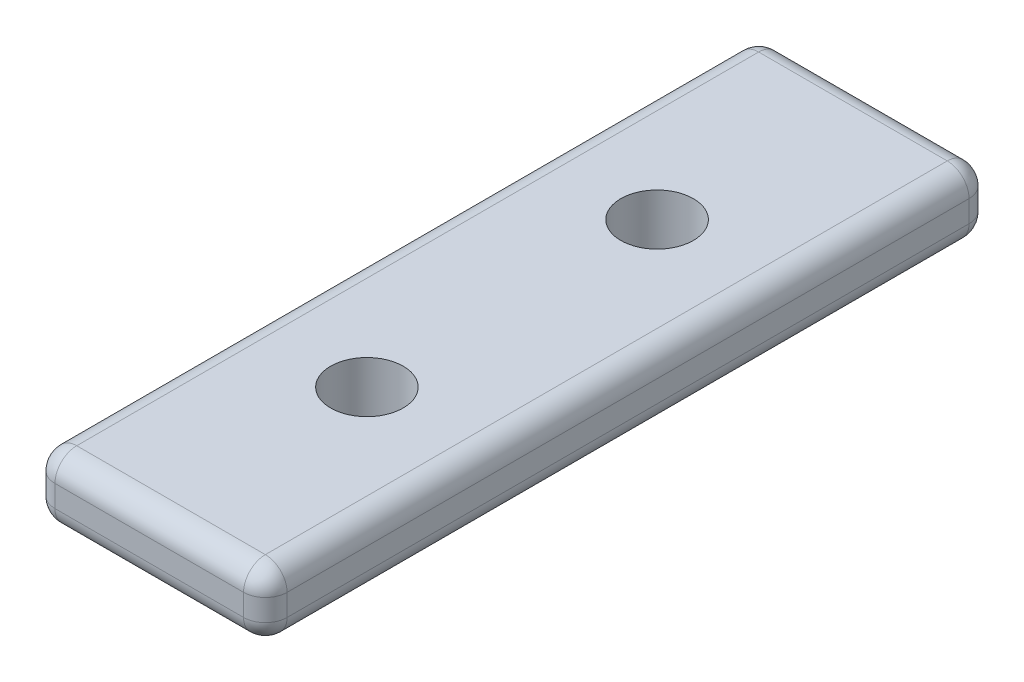
ISO-10303-21;
HEADER;
FILE_DESCRIPTION(('STEP AP214'),'2;1');
FILE_NAME('part.step','',(''),(''),'','','');
FILE_SCHEMA(('AUTOMOTIVE_DESIGN { 1 0 10303 214 1 1 1 1 }'));
ENDSEC;
DATA;
#1=APPLICATION_CONTEXT('core data for automotive mechanical design processes');
#2=APPLICATION_PROTOCOL_DEFINITION('international standard','automotive_design',2000,#1);
#3=PRODUCT_CONTEXT('',#1,'mechanical');
#4=PRODUCT('Part','Part','',(#3));
#5=PRODUCT_RELATED_PRODUCT_CATEGORY('part','',(#4));
#6=PRODUCT_DEFINITION_FORMATION('','',#4);
#7=PRODUCT_DEFINITION_CONTEXT('part definition',#1,'design');
#8=PRODUCT_DEFINITION('design','',#6,#7);
#9=PRODUCT_DEFINITION_SHAPE('','',#8);
#10=(LENGTH_UNIT() NAMED_UNIT(*) SI_UNIT(.MILLI.,.METRE.));
#11=(NAMED_UNIT(*) PLANE_ANGLE_UNIT() SI_UNIT($,.RADIAN.));
#12=(NAMED_UNIT(*) SI_UNIT($,.STERADIAN.) SOLID_ANGLE_UNIT());
#13=UNCERTAINTY_MEASURE_WITH_UNIT(LENGTH_MEASURE(1.E-05),#10,'distance_accuracy_value','');
#14=(GEOMETRIC_REPRESENTATION_CONTEXT(3) GLOBAL_UNCERTAINTY_ASSIGNED_CONTEXT((#13)) GLOBAL_UNIT_ASSIGNED_CONTEXT((#10,
#11,#12)) REPRESENTATION_CONTEXT('',''));
#15=CARTESIAN_POINT('',(0.,0.,0.));
#16=DIRECTION('',(0.,0.,1.));
#17=DIRECTION('',(1.,0.,0.));
#18=AXIS2_PLACEMENT_3D('',#15,#16,#17);
#19=CARTESIAN_POINT('',(8.,2.25,50.));
#20=DIRECTION('',(-1.,0.,0.));
#21=DIRECTION('',(0.,0.,1.));
#22=AXIS2_PLACEMENT_3D('',#19,#20,#21);
#23=PLANE('',#22);
#24=DIRECTION('',(0.,0.,-1.));
#25=VECTOR('',#24,1.);
#26=CARTESIAN_POINT('',(8.,0.75,50.));
#27=LINE('',#26,#25);
#28=CARTESIAN_POINT('',(8.,0.75,1.5));
#29=VERTEX_POINT('',#28);
#30=CARTESIAN_POINT('',(8.,0.75,48.5));
#31=VERTEX_POINT('',#30);
#32=EDGE_CURVE('E166',#29,#31,#27,.F.);
#33=ORIENTED_EDGE('',*,*,#32,.T.);
#34=DIRECTION('',(0.,1.,0.));
#35=VECTOR('',#34,1.);
#36=CARTESIAN_POINT('',(8.,-2.25,48.5));
#37=LINE('',#36,#35);
#38=CARTESIAN_POINT('',(8.,-0.75,48.5));
#39=VERTEX_POINT('',#38);
#40=EDGE_CURVE('E172',#31,#39,#37,.F.);
#41=ORIENTED_EDGE('',*,*,#40,.T.);
#42=DIRECTION('',(0.,0.,-1.));
#43=VECTOR('',#42,1.);
#44=CARTESIAN_POINT('',(8.,-0.75,50.));
#45=LINE('',#44,#43);
#46=CARTESIAN_POINT('',(8.,-0.75,1.5));
#47=VERTEX_POINT('',#46);
#48=EDGE_CURVE('E170',#39,#47,#45,.T.);
#49=ORIENTED_EDGE('',*,*,#48,.T.);
#50=DIRECTION('',(0.,1.,0.));
#51=VECTOR('',#50,1.);
#52=CARTESIAN_POINT('',(8.,2.25,1.5));
#53=LINE('',#52,#51);
#54=EDGE_CURVE('E168',#47,#29,#53,.T.);
#55=ORIENTED_EDGE('',*,*,#54,.T.);
#56=EDGE_LOOP('',(#33,#41,#49,#55));
#57=FACE_BOUND('',#56,.T.);
#58=ADVANCED_FACE('F30',(#57),#23,.F.);
#59=CARTESIAN_POINT('',(-8.,2.25,50.));
#60=DIRECTION('',(0.,-1.,0.));
#61=DIRECTION('',(0.,0.,-1.));
#62=AXIS2_PLACEMENT_3D('',#59,#60,#61);
#63=PLANE('',#62);
#64=CARTESIAN_POINT('',(0.,2.25,35.));
#65=DIRECTION('',(0.,-1.,0.));
#66=DIRECTION('',(0.,0.,-1.));
#67=AXIS2_PLACEMENT_3D('',#64,#65,#66);
#68=CIRCLE('',#67,2.5);
#69=CARTESIAN_POINT('',(0.,2.25,32.5));
#70=VERTEX_POINT('',#69);
#71=EDGE_CURVE('E557',#70,#70,#68,.T.);
#72=ORIENTED_EDGE('',*,*,#71,.T.);
#73=EDGE_LOOP('',(#72));
#74=FACE_BOUND('',#73,.T.);
#75=CARTESIAN_POINT('',(0.,2.25,15.));
#76=DIRECTION('',(0.,-1.,0.));
#77=DIRECTION('',(0.,0.,-1.));
#78=AXIS2_PLACEMENT_3D('',#75,#76,#77);
#79=CIRCLE('',#78,2.5);
#80=CARTESIAN_POINT('',(0.,2.25,12.5));
#81=VERTEX_POINT('',#80);
#82=EDGE_CURVE('E129',#81,#81,#79,.T.);
#83=ORIENTED_EDGE('',*,*,#82,.T.);
#84=EDGE_LOOP('',(#83));
#85=FACE_BOUND('',#84,.T.);
#86=DIRECTION('',(-1.,0.,0.));
#87=VECTOR('',#86,1.);
#88=CARTESIAN_POINT('',(-8.,2.25,1.5));
#89=LINE('',#88,#87);
#90=CARTESIAN_POINT('',(6.5,2.25,1.5));
#91=VERTEX_POINT('',#90);
#92=CARTESIAN_POINT('',(-6.5,2.25,1.5));
#93=VERTEX_POINT('',#92);
#94=EDGE_CURVE('E177',#91,#93,#89,.T.);
#95=ORIENTED_EDGE('',*,*,#94,.T.);
#96=DIRECTION('',(0.,0.,-1.));
#97=VECTOR('',#96,1.);
#98=CARTESIAN_POINT('',(-6.5,2.25,50.));
#99=LINE('',#98,#97);
#100=CARTESIAN_POINT('',(-6.5,2.25,48.5));
#101=VERTEX_POINT('',#100);
#102=EDGE_CURVE('E182',#93,#101,#99,.F.);
#103=ORIENTED_EDGE('',*,*,#102,.T.);
#104=DIRECTION('',(-1.,0.,0.));
#105=VECTOR('',#104,1.);
#106=CARTESIAN_POINT('',(8.,2.25,48.5));
#107=LINE('',#106,#105);
#108=CARTESIAN_POINT('',(6.5,2.25,48.5));
#109=VERTEX_POINT('',#108);
#110=EDGE_CURVE('E179',#101,#109,#107,.F.);
#111=ORIENTED_EDGE('',*,*,#110,.T.);
#112=DIRECTION('',(0.,0.,-1.));
#113=VECTOR('',#112,1.);
#114=CARTESIAN_POINT('',(6.5,2.25,50.));
#115=LINE('',#114,#113);
#116=EDGE_CURVE('E175',#109,#91,#115,.T.);
#117=ORIENTED_EDGE('',*,*,#116,.T.);
#118=EDGE_LOOP('',(#95,#103,#111,#117));
#119=FACE_BOUND('',#118,.T.);
#120=ADVANCED_FACE('F267',(#74,#85,#119),#63,.F.);
#121=CARTESIAN_POINT('',(-8.,2.25,50.));
#122=DIRECTION('',(1.,0.,0.));
#123=DIRECTION('',(0.,0.,-1.));
#124=AXIS2_PLACEMENT_3D('',#121,#122,#123);
#125=PLANE('',#124);
#126=DIRECTION('',(0.,0.,-1.));
#127=VECTOR('',#126,1.);
#128=CARTESIAN_POINT('',(-8.,-0.75,50.));
#129=LINE('',#128,#127);
#130=CARTESIAN_POINT('',(-8.,-0.75,1.5));
#131=VERTEX_POINT('',#130);
#132=CARTESIAN_POINT('',(-8.,-0.75,48.5));
#133=VERTEX_POINT('',#132);
#134=EDGE_CURVE('E163',#131,#133,#129,.F.);
#135=ORIENTED_EDGE('',*,*,#134,.T.);
#136=DIRECTION('',(0.,-1.,0.));
#137=VECTOR('',#136,1.);
#138=CARTESIAN_POINT('',(-8.,2.25,48.5));
#139=LINE('',#138,#137);
#140=CARTESIAN_POINT('',(-8.,0.75,48.5));
#141=VERTEX_POINT('',#140);
#142=EDGE_CURVE('E126',#133,#141,#139,.F.);
#143=ORIENTED_EDGE('',*,*,#142,.T.);
#144=DIRECTION('',(0.,0.,-1.));
#145=VECTOR('',#144,1.);
#146=CARTESIAN_POINT('',(-8.,0.75,50.));
#147=LINE('',#146,#145);
#148=CARTESIAN_POINT('',(-8.,0.75,1.5));
#149=VERTEX_POINT('',#148);
#150=EDGE_CURVE('E156',#141,#149,#147,.T.);
#151=ORIENTED_EDGE('',*,*,#150,.T.);
#152=DIRECTION('',(0.,-1.,0.));
#153=VECTOR('',#152,1.);
#154=CARTESIAN_POINT('',(-8.,2.25,1.5));
#155=LINE('',#154,#153);
#156=EDGE_CURVE('E161',#149,#131,#155,.T.);
#157=ORIENTED_EDGE('',*,*,#156,.T.);
#158=EDGE_LOOP('',(#135,#143,#151,#157));
#159=FACE_BOUND('',#158,.T.);
#160=ADVANCED_FACE('F316',(#159),#125,.F.);
#161=CARTESIAN_POINT('',(-8.,-2.25,50.));
#162=DIRECTION('',(0.,1.,0.));
#163=DIRECTION('',(0.,0.,1.));
#164=AXIS2_PLACEMENT_3D('',#161,#162,#163);
#165=PLANE('',#164);
#166=CARTESIAN_POINT('',(0.,-2.25,35.));
#167=DIRECTION('',(0.,-1.,0.));
#168=DIRECTION('',(0.,0.,-1.));
#169=AXIS2_PLACEMENT_3D('',#166,#167,#168);
#170=CIRCLE('',#169,2.5);
#171=CARTESIAN_POINT('',(0.,-2.25,32.5));
#172=VERTEX_POINT('',#171);
#173=EDGE_CURVE('E553',#172,#172,#170,.T.);
#174=ORIENTED_EDGE('',*,*,#173,.F.);
#175=EDGE_LOOP('',(#174));
#176=FACE_BOUND('',#175,.T.);
#177=CARTESIAN_POINT('',(0.,-2.25,15.));
#178=DIRECTION('',(0.,-1.,0.));
#179=DIRECTION('',(0.,0.,-1.));
#180=AXIS2_PLACEMENT_3D('',#177,#178,#179);
#181=CIRCLE('',#180,2.5);
#182=CARTESIAN_POINT('',(0.,-2.25,12.5));
#183=VERTEX_POINT('',#182);
#184=EDGE_CURVE('E556',#183,#183,#181,.T.);
#185=ORIENTED_EDGE('',*,*,#184,.F.);
#186=EDGE_LOOP('',(#185));
#187=FACE_BOUND('',#186,.T.);
#188=DIRECTION('',(0.,0.,-1.));
#189=VECTOR('',#188,1.);
#190=CARTESIAN_POINT('',(6.5,-2.25,50.));
#191=LINE('',#190,#189);
#192=CARTESIAN_POINT('',(6.5,-2.25,1.5));
#193=VERTEX_POINT('',#192);
#194=CARTESIAN_POINT('',(6.5,-2.25,48.5));
#195=VERTEX_POINT('',#194);
#196=EDGE_CURVE('E186',#193,#195,#191,.F.);
#197=ORIENTED_EDGE('',*,*,#196,.T.);
#198=DIRECTION('',(1.,0.,0.));
#199=VECTOR('',#198,1.);
#200=CARTESIAN_POINT('',(-8.,-2.25,48.5));
#201=LINE('',#200,#199);
#202=CARTESIAN_POINT('',(-6.5,-2.25,48.5));
#203=VERTEX_POINT('',#202);
#204=EDGE_CURVE('E190',#195,#203,#201,.F.);
#205=ORIENTED_EDGE('',*,*,#204,.T.);
#206=DIRECTION('',(0.,0.,-1.));
#207=VECTOR('',#206,1.);
#208=CARTESIAN_POINT('',(-6.5,-2.25,50.));
#209=LINE('',#208,#207);
#210=CARTESIAN_POINT('',(-6.5,-2.25,1.5));
#211=VERTEX_POINT('',#210);
#212=EDGE_CURVE('E188',#203,#211,#209,.T.);
#213=ORIENTED_EDGE('',*,*,#212,.T.);
#214=DIRECTION('',(1.,0.,0.));
#215=VECTOR('',#214,1.);
#216=CARTESIAN_POINT('',(-8.,-2.25,1.5));
#217=LINE('',#216,#215);
#218=EDGE_CURVE('E184',#211,#193,#217,.T.);
#219=ORIENTED_EDGE('',*,*,#218,.T.);
#220=EDGE_LOOP('',(#197,#205,#213,#219));
#221=FACE_BOUND('',#220,.T.);
#222=ADVANCED_FACE('F308',(#176,#187,#221),#165,.F.);
#223=CARTESIAN_POINT('',(8.,-2.25,50.));
#224=DIRECTION('',(0.,0.,1.));
#225=DIRECTION('',(1.,0.,0.));
#226=AXIS2_PLACEMENT_3D('',#223,#224,#225);
#227=PLANE('',#226);
#228=DIRECTION('',(0.,1.,0.));
#229=VECTOR('',#228,1.);
#230=CARTESIAN_POINT('',(6.5,2.25,50.));
#231=LINE('',#230,#229);
#232=CARTESIAN_POINT('',(6.5,-0.75,50.));
#233=VERTEX_POINT('',#232);
#234=CARTESIAN_POINT('',(6.5,0.75,50.));
#235=VERTEX_POINT('',#234);
#236=EDGE_CURVE('E149',#233,#235,#231,.T.);
#237=ORIENTED_EDGE('',*,*,#236,.T.);
#238=DIRECTION('',(-1.,0.,0.));
#239=VECTOR('',#238,1.);
#240=CARTESIAN_POINT('',(-8.,0.75,50.));
#241=LINE('',#240,#239);
#242=CARTESIAN_POINT('',(-6.5,0.75,50.));
#243=VERTEX_POINT('',#242);
#244=EDGE_CURVE('E153',#235,#243,#241,.T.);
#245=ORIENTED_EDGE('',*,*,#244,.T.);
#246=DIRECTION('',(0.,-1.,0.));
#247=VECTOR('',#246,1.);
#248=CARTESIAN_POINT('',(-6.5,-2.25,50.));
#249=LINE('',#248,#247);
#250=CARTESIAN_POINT('',(-6.5,-0.75,50.));
#251=VERTEX_POINT('',#250);
#252=EDGE_CURVE('E124',#243,#251,#249,.T.);
#253=ORIENTED_EDGE('',*,*,#252,.T.);
#254=DIRECTION('',(1.,0.,0.));
#255=VECTOR('',#254,1.);
#256=CARTESIAN_POINT('',(8.,-0.75,50.));
#257=LINE('',#256,#255);
#258=EDGE_CURVE('E143',#251,#233,#257,.T.);
#259=ORIENTED_EDGE('',*,*,#258,.T.);
#260=EDGE_LOOP('',(#237,#245,#253,#259));
#261=FACE_BOUND('',#260,.T.);
#262=ADVANCED_FACE('F151',(#261),#227,.T.);
#263=CARTESIAN_POINT('',(8.,-2.25,0.));
#264=DIRECTION('',(0.,0.,1.));
#265=DIRECTION('',(1.,0.,0.));
#266=AXIS2_PLACEMENT_3D('',#263,#264,#265);
#267=PLANE('',#266);
#268=DIRECTION('',(1.,0.,0.));
#269=VECTOR('',#268,1.);
#270=CARTESIAN_POINT('',(8.,-0.75,0.));
#271=LINE('',#270,#269);
#272=CARTESIAN_POINT('',(6.5,-0.75,0.));
#273=VERTEX_POINT('',#272);
#274=CARTESIAN_POINT('',(-6.5,-0.75,0.));
#275=VERTEX_POINT('',#274);
#276=EDGE_CURVE('E39',#273,#275,#271,.F.);
#277=ORIENTED_EDGE('',*,*,#276,.T.);
#278=DIRECTION('',(0.,-1.,0.));
#279=VECTOR('',#278,1.);
#280=CARTESIAN_POINT('',(-6.5,-2.25,0.));
#281=LINE('',#280,#279);
#282=CARTESIAN_POINT('',(-6.5,0.75,0.));
#283=VERTEX_POINT('',#282);
#284=EDGE_CURVE('E11',#275,#283,#281,.F.);
#285=ORIENTED_EDGE('',*,*,#284,.T.);
#286=DIRECTION('',(-1.,0.,0.));
#287=VECTOR('',#286,1.);
#288=CARTESIAN_POINT('',(8.,0.75,0.));
#289=LINE('',#288,#287);
#290=CARTESIAN_POINT('',(6.5,0.75,0.));
#291=VERTEX_POINT('',#290);
#292=EDGE_CURVE('E193',#283,#291,#289,.F.);
#293=ORIENTED_EDGE('',*,*,#292,.T.);
#294=DIRECTION('',(0.,1.,0.));
#295=VECTOR('',#294,1.);
#296=CARTESIAN_POINT('',(6.5,-2.25,0.));
#297=LINE('',#296,#295);
#298=EDGE_CURVE('E50',#291,#273,#297,.F.);
#299=ORIENTED_EDGE('',*,*,#298,.T.);
#300=EDGE_LOOP('',(#277,#285,#293,#299));
#301=FACE_BOUND('',#300,.T.);
#302=ADVANCED_FACE('F301',(#301),#267,.F.);
#303=CARTESIAN_POINT('',(6.5,2.25,1.5));
#304=DIRECTION('',(0.,1.,0.));
#305=DIRECTION('',(0.,0.,1.));
#306=AXIS2_PLACEMENT_3D('',#303,#304,#305);
#307=CYLINDRICAL_SURFACE('',#306,1.5);
#308=CARTESIAN_POINT('',(6.5,0.75,1.5));
#309=DIRECTION('',(0.,1.,0.));
#310=DIRECTION('',(0.,0.,1.));
#311=AXIS2_PLACEMENT_3D('',#308,#309,#310);
#312=CIRCLE('',#311,1.5);
#313=EDGE_CURVE('E34',#29,#291,#312,.T.);
#314=ORIENTED_EDGE('',*,*,#313,.F.);
#315=ORIENTED_EDGE('',*,*,#54,.F.);
#316=CARTESIAN_POINT('',(6.5,-0.75,1.5));
#317=DIRECTION('',(0.,-1.,0.));
#318=DIRECTION('',(0.,0.,-1.));
#319=AXIS2_PLACEMENT_3D('',#316,#317,#318);
#320=CIRCLE('',#319,1.5);
#321=EDGE_CURVE('E246',#273,#47,#320,.T.);
#322=ORIENTED_EDGE('',*,*,#321,.F.);
#323=ORIENTED_EDGE('',*,*,#298,.F.);
#324=EDGE_LOOP('',(#314,#315,#322,#323));
#325=FACE_BOUND('',#324,.T.);
#326=ADVANCED_FACE('F32',(#325),#307,.T.);
#327=CARTESIAN_POINT('',(6.5,0.75,1.5));
#328=DIRECTION('',(0.,0.,1.));
#329=DIRECTION('',(1.,0.,0.));
#330=AXIS2_PLACEMENT_3D('',#327,#328,#329);
#331=SPHERICAL_SURFACE('',#330,1.5);
#332=CARTESIAN_POINT('',(6.5,0.75,1.5));
#333=DIRECTION('',(0.,0.,-1.));
#334=DIRECTION('',(-1.,0.,0.));
#335=AXIS2_PLACEMENT_3D('',#332,#333,#334);
#336=CIRCLE('',#335,1.5);
#337=EDGE_CURVE('E241',#29,#91,#336,.F.);
#338=ORIENTED_EDGE('',*,*,#337,.F.);
#339=ORIENTED_EDGE('',*,*,#313,.T.);
#340=CARTESIAN_POINT('',(6.5,0.75,1.5));
#341=DIRECTION('',(1.,0.,0.));
#342=DIRECTION('',(0.,0.,-1.));
#343=AXIS2_PLACEMENT_3D('',#340,#341,#342);
#344=CIRCLE('',#343,1.5);
#345=EDGE_CURVE('E244',#91,#291,#344,.F.);
#346=ORIENTED_EDGE('',*,*,#345,.F.);
#347=EDGE_LOOP('',(#338,#339,#346));
#348=FACE_BOUND('',#347,.T.);
#349=ADVANCED_FACE('F256',(#348),#331,.T.);
#350=CARTESIAN_POINT('',(6.5,-0.75,1.5));
#351=DIRECTION('',(0.,0.,1.));
#352=DIRECTION('',(1.,0.,0.));
#353=AXIS2_PLACEMENT_3D('',#350,#351,#352);
#354=SPHERICAL_SURFACE('',#353,1.5);
#355=CARTESIAN_POINT('',(6.5,-0.75,1.5));
#356=DIRECTION('',(1.,0.,0.));
#357=DIRECTION('',(0.,0.,-1.));
#358=AXIS2_PLACEMENT_3D('',#355,#356,#357);
#359=CIRCLE('',#358,1.5);
#360=EDGE_CURVE('E235',#273,#193,#359,.F.);
#361=ORIENTED_EDGE('',*,*,#360,.F.);
#362=ORIENTED_EDGE('',*,*,#321,.T.);
#363=CARTESIAN_POINT('',(6.5,-0.75,1.5));
#364=DIRECTION('',(0.,0.,-1.));
#365=DIRECTION('',(-1.,0.,0.));
#366=AXIS2_PLACEMENT_3D('',#363,#364,#365);
#367=CIRCLE('',#366,1.5);
#368=EDGE_CURVE('E238',#193,#47,#367,.F.);
#369=ORIENTED_EDGE('',*,*,#368,.F.);
#370=EDGE_LOOP('',(#361,#362,#369));
#371=FACE_BOUND('',#370,.T.);
#372=ADVANCED_FACE('F287',(#371),#354,.T.);
#373=CARTESIAN_POINT('',(-8.,0.75,1.5));
#374=DIRECTION('',(-1.,0.,0.));
#375=DIRECTION('',(0.,0.,1.));
#376=AXIS2_PLACEMENT_3D('',#373,#374,#375);
#377=CYLINDRICAL_SURFACE('',#376,1.5);
#378=ORIENTED_EDGE('',*,*,#345,.T.);
#379=ORIENTED_EDGE('',*,*,#292,.F.);
#380=CARTESIAN_POINT('',(-6.5,0.75,1.5));
#381=DIRECTION('',(-1.,0.,0.));
#382=DIRECTION('',(0.,0.,1.));
#383=AXIS2_PLACEMENT_3D('',#380,#381,#382);
#384=CIRCLE('',#383,1.5);
#385=EDGE_CURVE('E230',#93,#283,#384,.T.);
#386=ORIENTED_EDGE('',*,*,#385,.F.);
#387=ORIENTED_EDGE('',*,*,#94,.F.);
#388=EDGE_LOOP('',(#378,#379,#386,#387));
#389=FACE_BOUND('',#388,.T.);
#390=ADVANCED_FACE('F263',(#389),#377,.T.);
#391=CARTESIAN_POINT('',(6.5,0.75,50.));
#392=DIRECTION('',(0.,0.,-1.));
#393=DIRECTION('',(-1.,0.,0.));
#394=AXIS2_PLACEMENT_3D('',#391,#392,#393);
#395=CYLINDRICAL_SURFACE('',#394,1.5);
#396=ORIENTED_EDGE('',*,*,#337,.T.);
#397=ORIENTED_EDGE('',*,*,#116,.F.);
#398=CARTESIAN_POINT('',(6.5,0.75,48.5));
#399=DIRECTION('',(0.,0.,1.));
#400=DIRECTION('',(1.,0.,0.));
#401=AXIS2_PLACEMENT_3D('',#398,#399,#400);
#402=CIRCLE('',#401,1.5);
#403=EDGE_CURVE('E227',#31,#109,#402,.T.);
#404=ORIENTED_EDGE('',*,*,#403,.F.);
#405=ORIENTED_EDGE('',*,*,#32,.F.);
#406=EDGE_LOOP('',(#396,#397,#404,#405));
#407=FACE_BOUND('',#406,.T.);
#408=ADVANCED_FACE('F273',(#407),#395,.T.);
#409=CARTESIAN_POINT('',(6.5,-2.25,48.5));
#410=DIRECTION('',(0.,-1.,0.));
#411=DIRECTION('',(0.,0.,-1.));
#412=AXIS2_PLACEMENT_3D('',#409,#410,#411);
#413=CYLINDRICAL_SURFACE('',#412,1.5);
#414=CARTESIAN_POINT('',(6.5,-0.75,48.5));
#415=DIRECTION('',(0.,-1.,0.));
#416=DIRECTION('',(0.,0.,-1.));
#417=AXIS2_PLACEMENT_3D('',#414,#415,#416);
#418=CIRCLE('',#417,1.5);
#419=EDGE_CURVE('E221',#39,#233,#418,.T.);
#420=ORIENTED_EDGE('',*,*,#419,.F.);
#421=ORIENTED_EDGE('',*,*,#40,.F.);
#422=CARTESIAN_POINT('',(6.5,0.75,48.5));
#423=DIRECTION('',(0.,1.,0.));
#424=DIRECTION('',(0.,0.,1.));
#425=AXIS2_PLACEMENT_3D('',#422,#423,#424);
#426=CIRCLE('',#425,1.5);
#427=EDGE_CURVE('E224',#235,#31,#426,.T.);
#428=ORIENTED_EDGE('',*,*,#427,.F.);
#429=ORIENTED_EDGE('',*,*,#236,.F.);
#430=EDGE_LOOP('',(#420,#421,#428,#429));
#431=FACE_BOUND('',#430,.T.);
#432=ADVANCED_FACE('F279',(#431),#413,.T.);
#433=CARTESIAN_POINT('',(6.5,-0.75,50.));
#434=DIRECTION('',(0.,0.,-1.));
#435=DIRECTION('',(-1.,0.,0.));
#436=AXIS2_PLACEMENT_3D('',#433,#434,#435);
#437=CYLINDRICAL_SURFACE('',#436,1.5);
#438=ORIENTED_EDGE('',*,*,#368,.T.);
#439=ORIENTED_EDGE('',*,*,#48,.F.);
#440=CARTESIAN_POINT('',(6.5,-0.75,48.5));
#441=DIRECTION('',(0.,0.,1.));
#442=DIRECTION('',(1.,0.,0.));
#443=AXIS2_PLACEMENT_3D('',#440,#441,#442);
#444=CIRCLE('',#443,1.5);
#445=EDGE_CURVE('E219',#195,#39,#444,.T.);
#446=ORIENTED_EDGE('',*,*,#445,.F.);
#447=ORIENTED_EDGE('',*,*,#196,.F.);
#448=EDGE_LOOP('',(#438,#439,#446,#447));
#449=FACE_BOUND('',#448,.T.);
#450=ADVANCED_FACE('F285',(#449),#437,.T.);
#451=CARTESIAN_POINT('',(-8.,-0.75,1.5));
#452=DIRECTION('',(1.,0.,0.));
#453=DIRECTION('',(0.,0.,-1.));
#454=AXIS2_PLACEMENT_3D('',#451,#452,#453);
#455=CYLINDRICAL_SURFACE('',#454,1.5);
#456=ORIENTED_EDGE('',*,*,#360,.T.);
#457=ORIENTED_EDGE('',*,*,#218,.F.);
#458=CARTESIAN_POINT('',(-6.5,-0.75,1.5));
#459=DIRECTION('',(-1.,0.,0.));
#460=DIRECTION('',(0.,0.,1.));
#461=AXIS2_PLACEMENT_3D('',#458,#459,#460);
#462=CIRCLE('',#461,1.5);
#463=EDGE_CURVE('E216',#275,#211,#462,.T.);
#464=ORIENTED_EDGE('',*,*,#463,.F.);
#465=ORIENTED_EDGE('',*,*,#276,.F.);
#466=EDGE_LOOP('',(#456,#457,#464,#465));
#467=FACE_BOUND('',#466,.T.);
#468=ADVANCED_FACE('F291',(#467),#455,.T.);
#469=CARTESIAN_POINT('',(-6.5,2.25,1.5));
#470=DIRECTION('',(0.,-1.,0.));
#471=DIRECTION('',(0.,0.,-1.));
#472=AXIS2_PLACEMENT_3D('',#469,#470,#471);
#473=CYLINDRICAL_SURFACE('',#472,1.5);
#474=CARTESIAN_POINT('',(-6.5,0.75,1.5));
#475=DIRECTION('',(0.,1.,0.));
#476=DIRECTION('',(0.,0.,1.));
#477=AXIS2_PLACEMENT_3D('',#474,#475,#476);
#478=CIRCLE('',#477,1.5);
#479=EDGE_CURVE('E232',#283,#149,#478,.T.);
#480=ORIENTED_EDGE('',*,*,#479,.F.);
#481=ORIENTED_EDGE('',*,*,#284,.F.);
#482=CARTESIAN_POINT('',(-6.5,-0.75,1.5));
#483=DIRECTION('',(0.,-1.,0.));
#484=DIRECTION('',(0.,0.,-1.));
#485=AXIS2_PLACEMENT_3D('',#482,#483,#484);
#486=CIRCLE('',#485,1.5);
#487=EDGE_CURVE('E213',#131,#275,#486,.T.);
#488=ORIENTED_EDGE('',*,*,#487,.F.);
#489=ORIENTED_EDGE('',*,*,#156,.F.);
#490=EDGE_LOOP('',(#480,#481,#488,#489));
#491=FACE_BOUND('',#490,.T.);
#492=ADVANCED_FACE('F300',(#491),#473,.T.);
#493=CARTESIAN_POINT('',(-6.5,0.75,1.5));
#494=DIRECTION('',(0.,0.,1.));
#495=DIRECTION('',(1.,0.,0.));
#496=AXIS2_PLACEMENT_3D('',#493,#494,#495);
#497=SPHERICAL_SURFACE('',#496,1.5);
#498=ORIENTED_EDGE('',*,*,#385,.T.);
#499=ORIENTED_EDGE('',*,*,#479,.T.);
#500=CARTESIAN_POINT('',(-6.5,0.75,1.5));
#501=DIRECTION('',(0.,0.,-1.));
#502=DIRECTION('',(-1.,0.,0.));
#503=AXIS2_PLACEMENT_3D('',#500,#501,#502);
#504=CIRCLE('',#503,1.5);
#505=EDGE_CURVE('E210',#93,#149,#504,.F.);
#506=ORIENTED_EDGE('',*,*,#505,.F.);
#507=EDGE_LOOP('',(#498,#499,#506));
#508=FACE_BOUND('',#507,.T.);
#509=ADVANCED_FACE('F352',(#508),#497,.T.);
#510=CARTESIAN_POINT('',(6.5,0.75,48.5));
#511=DIRECTION('',(0.,0.,1.));
#512=DIRECTION('',(1.,0.,0.));
#513=AXIS2_PLACEMENT_3D('',#510,#511,#512);
#514=SPHERICAL_SURFACE('',#513,1.5);
#515=ORIENTED_EDGE('',*,*,#427,.T.);
#516=ORIENTED_EDGE('',*,*,#403,.T.);
#517=CARTESIAN_POINT('',(6.5,0.75,48.5));
#518=DIRECTION('',(1.,0.,0.));
#519=DIRECTION('',(0.,0.,-1.));
#520=AXIS2_PLACEMENT_3D('',#517,#518,#519);
#521=CIRCLE('',#520,1.5);
#522=EDGE_CURVE('E208',#235,#109,#521,.F.);
#523=ORIENTED_EDGE('',*,*,#522,.F.);
#524=EDGE_LOOP('',(#515,#516,#523));
#525=FACE_BOUND('',#524,.T.);
#526=ADVANCED_FACE('F349',(#525),#514,.T.);
#527=CARTESIAN_POINT('',(6.5,-0.75,48.5));
#528=DIRECTION('',(0.,0.,1.));
#529=DIRECTION('',(1.,0.,0.));
#530=AXIS2_PLACEMENT_3D('',#527,#528,#529);
#531=SPHERICAL_SURFACE('',#530,1.5);
#532=ORIENTED_EDGE('',*,*,#445,.T.);
#533=ORIENTED_EDGE('',*,*,#419,.T.);
#534=CARTESIAN_POINT('',(6.5,-0.75,48.5));
#535=DIRECTION('',(1.,0.,0.));
#536=DIRECTION('',(0.,0.,-1.));
#537=AXIS2_PLACEMENT_3D('',#534,#535,#536);
#538=CIRCLE('',#537,1.5);
#539=EDGE_CURVE('E146',#195,#233,#538,.F.);
#540=ORIENTED_EDGE('',*,*,#539,.F.);
#541=EDGE_LOOP('',(#532,#533,#540));
#542=FACE_BOUND('',#541,.T.);
#543=ADVANCED_FACE('F346',(#542),#531,.T.);
#544=CARTESIAN_POINT('',(-6.5,-0.75,1.5));
#545=DIRECTION('',(0.,0.,1.));
#546=DIRECTION('',(1.,0.,0.));
#547=AXIS2_PLACEMENT_3D('',#544,#545,#546);
#548=SPHERICAL_SURFACE('',#547,1.5);
#549=ORIENTED_EDGE('',*,*,#487,.T.);
#550=ORIENTED_EDGE('',*,*,#463,.T.);
#551=CARTESIAN_POINT('',(-6.5,-0.75,1.5));
#552=DIRECTION('',(0.,0.,-1.));
#553=DIRECTION('',(-1.,0.,0.));
#554=AXIS2_PLACEMENT_3D('',#551,#552,#553);
#555=CIRCLE('',#554,1.5);
#556=EDGE_CURVE('E204',#131,#211,#555,.F.);
#557=ORIENTED_EDGE('',*,*,#556,.F.);
#558=EDGE_LOOP('',(#549,#550,#557));
#559=FACE_BOUND('',#558,.T.);
#560=ADVANCED_FACE('F295',(#559),#548,.T.);
#561=CARTESIAN_POINT('',(-6.5,0.75,50.));
#562=DIRECTION('',(0.,0.,-1.));
#563=DIRECTION('',(-1.,0.,0.));
#564=AXIS2_PLACEMENT_3D('',#561,#562,#563);
#565=CYLINDRICAL_SURFACE('',#564,1.5);
#566=ORIENTED_EDGE('',*,*,#505,.T.);
#567=ORIENTED_EDGE('',*,*,#150,.F.);
#568=CARTESIAN_POINT('',(-6.5,0.75,48.5));
#569=DIRECTION('',(0.,0.,1.));
#570=DIRECTION('',(1.,0.,0.));
#571=AXIS2_PLACEMENT_3D('',#568,#569,#570);
#572=CIRCLE('',#571,1.5);
#573=EDGE_CURVE('E201',#101,#141,#572,.T.);
#574=ORIENTED_EDGE('',*,*,#573,.F.);
#575=ORIENTED_EDGE('',*,*,#102,.F.);
#576=EDGE_LOOP('',(#566,#567,#574,#575));
#577=FACE_BOUND('',#576,.T.);
#578=ADVANCED_FACE('F339',(#577),#565,.T.);
#579=CARTESIAN_POINT('',(8.,0.75,48.5));
#580=DIRECTION('',(1.,0.,0.));
#581=DIRECTION('',(0.,0.,-1.));
#582=AXIS2_PLACEMENT_3D('',#579,#580,#581);
#583=CYLINDRICAL_SURFACE('',#582,1.5);
#584=ORIENTED_EDGE('',*,*,#522,.T.);
#585=ORIENTED_EDGE('',*,*,#110,.F.);
#586=CARTESIAN_POINT('',(-6.5,0.75,48.5));
#587=DIRECTION('',(-1.,0.,0.));
#588=DIRECTION('',(0.,0.,1.));
#589=AXIS2_PLACEMENT_3D('',#586,#587,#588);
#590=CIRCLE('',#589,1.5);
#591=EDGE_CURVE('E140',#243,#101,#590,.T.);
#592=ORIENTED_EDGE('',*,*,#591,.F.);
#593=ORIENTED_EDGE('',*,*,#244,.F.);
#594=EDGE_LOOP('',(#584,#585,#592,#593));
#595=FACE_BOUND('',#594,.T.);
#596=ADVANCED_FACE('F336',(#595),#583,.T.);
#597=CARTESIAN_POINT('',(8.,-0.75,48.5));
#598=DIRECTION('',(-1.,0.,0.));
#599=DIRECTION('',(0.,0.,1.));
#600=AXIS2_PLACEMENT_3D('',#597,#598,#599);
#601=CYLINDRICAL_SURFACE('',#600,1.5);
#602=ORIENTED_EDGE('',*,*,#539,.T.);
#603=ORIENTED_EDGE('',*,*,#258,.F.);
#604=CARTESIAN_POINT('',(-6.5,-0.75,48.5));
#605=DIRECTION('',(-1.,0.,0.));
#606=DIRECTION('',(0.,0.,1.));
#607=AXIS2_PLACEMENT_3D('',#604,#605,#606);
#608=CIRCLE('',#607,1.5);
#609=EDGE_CURVE('E132',#203,#251,#608,.T.);
#610=ORIENTED_EDGE('',*,*,#609,.F.);
#611=ORIENTED_EDGE('',*,*,#204,.F.);
#612=EDGE_LOOP('',(#602,#603,#610,#611));
#613=FACE_BOUND('',#612,.T.);
#614=ADVANCED_FACE('F144',(#613),#601,.T.);
#615=CARTESIAN_POINT('',(-6.5,-0.75,50.));
#616=DIRECTION('',(0.,0.,-1.));
#617=DIRECTION('',(-1.,0.,0.));
#618=AXIS2_PLACEMENT_3D('',#615,#616,#617);
#619=CYLINDRICAL_SURFACE('',#618,1.5);
#620=ORIENTED_EDGE('',*,*,#556,.T.);
#621=ORIENTED_EDGE('',*,*,#212,.F.);
#622=CARTESIAN_POINT('',(-6.5,-0.75,48.5));
#623=DIRECTION('',(0.,0.,1.));
#624=DIRECTION('',(1.,0.,0.));
#625=AXIS2_PLACEMENT_3D('',#622,#623,#624);
#626=CIRCLE('',#625,1.5);
#627=EDGE_CURVE('E136',#133,#203,#626,.T.);
#628=ORIENTED_EDGE('',*,*,#627,.F.);
#629=ORIENTED_EDGE('',*,*,#134,.F.);
#630=EDGE_LOOP('',(#620,#621,#628,#629));
#631=FACE_BOUND('',#630,.T.);
#632=ADVANCED_FACE('F329',(#631),#619,.T.);
#633=CARTESIAN_POINT('',(-6.5,0.75,48.5));
#634=DIRECTION('',(0.,0.,1.));
#635=DIRECTION('',(1.,0.,0.));
#636=AXIS2_PLACEMENT_3D('',#633,#634,#635);
#637=SPHERICAL_SURFACE('',#636,1.5);
#638=ORIENTED_EDGE('',*,*,#591,.T.);
#639=ORIENTED_EDGE('',*,*,#573,.T.);
#640=CARTESIAN_POINT('',(-6.5,0.75,48.5));
#641=DIRECTION('',(0.,1.,0.));
#642=DIRECTION('',(0.,0.,1.));
#643=AXIS2_PLACEMENT_3D('',#640,#641,#642);
#644=CIRCLE('',#643,1.5);
#645=EDGE_CURVE('E128',#243,#141,#644,.F.);
#646=ORIENTED_EDGE('',*,*,#645,.F.);
#647=EDGE_LOOP('',(#638,#639,#646));
#648=FACE_BOUND('',#647,.T.);
#649=ADVANCED_FACE('F326',(#648),#637,.T.);
#650=CARTESIAN_POINT('',(-6.5,-0.75,48.5));
#651=DIRECTION('',(0.,0.,1.));
#652=DIRECTION('',(1.,0.,0.));
#653=AXIS2_PLACEMENT_3D('',#650,#651,#652);
#654=SPHERICAL_SURFACE('',#653,1.5);
#655=ORIENTED_EDGE('',*,*,#627,.T.);
#656=ORIENTED_EDGE('',*,*,#609,.T.);
#657=CARTESIAN_POINT('',(-6.5,-0.75,48.5));
#658=DIRECTION('',(0.,-1.,0.));
#659=DIRECTION('',(0.,0.,-1.));
#660=AXIS2_PLACEMENT_3D('',#657,#658,#659);
#661=CIRCLE('',#660,1.5);
#662=EDGE_CURVE('E120',#133,#251,#661,.F.);
#663=ORIENTED_EDGE('',*,*,#662,.F.);
#664=EDGE_LOOP('',(#655,#656,#663));
#665=FACE_BOUND('',#664,.T.);
#666=ADVANCED_FACE('F134',(#665),#654,.T.);
#667=CARTESIAN_POINT('',(-6.5,-2.25,48.5));
#668=DIRECTION('',(0.,1.,0.));
#669=DIRECTION('',(0.,0.,1.));
#670=AXIS2_PLACEMENT_3D('',#667,#668,#669);
#671=CYLINDRICAL_SURFACE('',#670,1.5);
#672=ORIENTED_EDGE('',*,*,#645,.T.);
#673=ORIENTED_EDGE('',*,*,#142,.F.);
#674=ORIENTED_EDGE('',*,*,#662,.T.);
#675=ORIENTED_EDGE('',*,*,#252,.F.);
#676=EDGE_LOOP('',(#672,#673,#674,#675));
#677=FACE_BOUND('',#676,.T.);
#678=ADVANCED_FACE('F122',(#677),#671,.T.);
#679=CARTESIAN_POINT('',(0.,2.75,15.));
#680=DIRECTION('',(0.,-1.,0.));
#681=DIRECTION('',(0.,0.,-1.));
#682=AXIS2_PLACEMENT_3D('',#679,#680,#681);
#683=CYLINDRICAL_SURFACE('',#682,2.5);
#684=ORIENTED_EDGE('',*,*,#184,.T.);
#685=EDGE_LOOP('',(#684));
#686=FACE_BOUND('',#685,.T.);
#687=ORIENTED_EDGE('',*,*,#82,.F.);
#688=EDGE_LOOP('',(#687));
#689=FACE_BOUND('',#688,.T.);
#690=ADVANCED_FACE('F323',(#686,#689),#683,.F.);
#691=CARTESIAN_POINT('',(0.,2.75,35.));
#692=DIRECTION('',(0.,-1.,0.));
#693=DIRECTION('',(0.,0.,-1.));
#694=AXIS2_PLACEMENT_3D('',#691,#692,#693);
#695=CYLINDRICAL_SURFACE('',#694,2.5);
#696=ORIENTED_EDGE('',*,*,#173,.T.);
#697=EDGE_LOOP('',(#696));
#698=FACE_BOUND('',#697,.T.);
#699=ORIENTED_EDGE('',*,*,#71,.F.);
#700=EDGE_LOOP('',(#699));
#701=FACE_BOUND('',#700,.T.);
#702=ADVANCED_FACE('F454',(#698,#701),#695,.F.);
#703=CLOSED_SHELL('',(#58,#120,#160,#222,#262,#302,#326,#349,#372,#390,#408,#432,#450,#468,#492,
#509,#526,#543,#560,#578,#596,#614,#632,#649,#666,#678,#690,#702));
#704=MANIFOLD_SOLID_BREP('B2',#703);
#705=ADVANCED_BREP_SHAPE_REPRESENTATION('',(#18,#704),#14);
#706=SHAPE_DEFINITION_REPRESENTATION(#9,#705);
ENDSEC;
END-ISO-10303-21;
